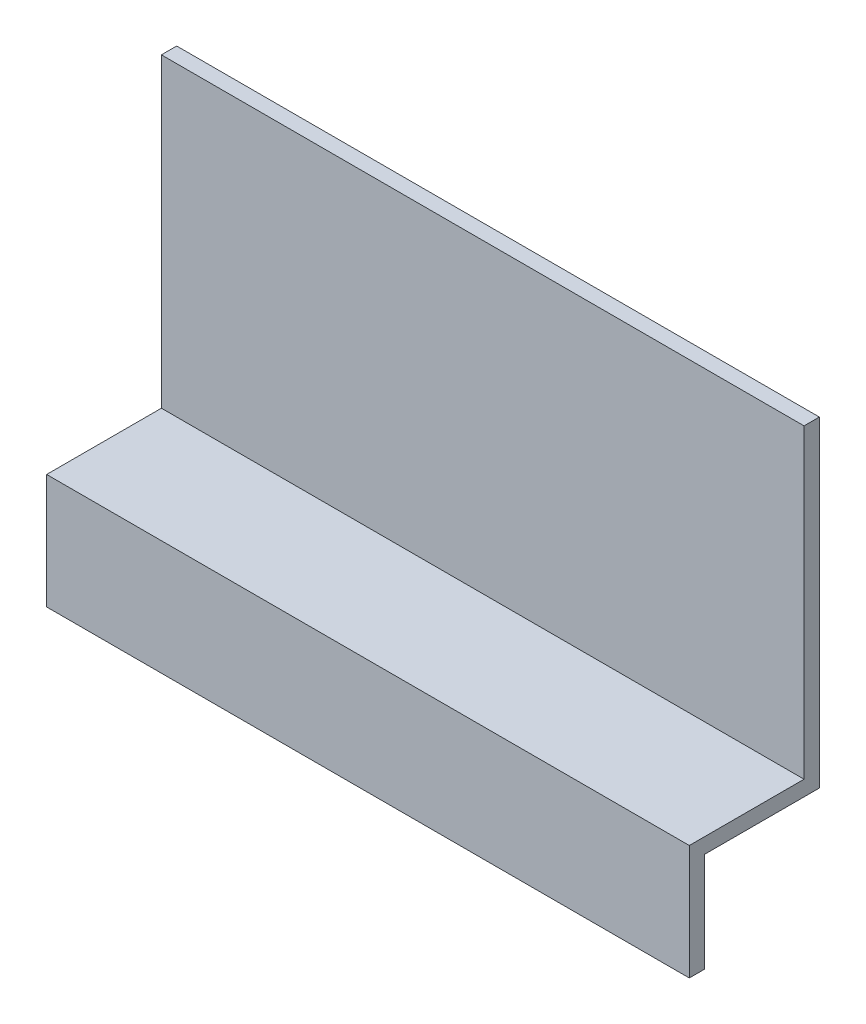
ISO-10303-21;
HEADER;
FILE_DESCRIPTION(('STEP AP214'),'2;1');
FILE_NAME('part.step','',(''),(''),'','','');
FILE_SCHEMA(('AUTOMOTIVE_DESIGN { 1 0 10303 214 1 1 1 1 }'));
ENDSEC;
DATA;
#1=APPLICATION_CONTEXT('core data for automotive mechanical design processes');
#2=APPLICATION_PROTOCOL_DEFINITION('international standard','automotive_design',2000,#1);
#3=PRODUCT_CONTEXT('',#1,'mechanical');
#4=PRODUCT('Part','Part','',(#3));
#5=PRODUCT_RELATED_PRODUCT_CATEGORY('part','',(#4));
#6=PRODUCT_DEFINITION_FORMATION('','',#4);
#7=PRODUCT_DEFINITION_CONTEXT('part definition',#1,'design');
#8=PRODUCT_DEFINITION('design','',#6,#7);
#9=PRODUCT_DEFINITION_SHAPE('','',#8);
#10=(LENGTH_UNIT() NAMED_UNIT(*) SI_UNIT(.MILLI.,.METRE.));
#11=(NAMED_UNIT(*) PLANE_ANGLE_UNIT() SI_UNIT($,.RADIAN.));
#12=(NAMED_UNIT(*) SI_UNIT($,.STERADIAN.) SOLID_ANGLE_UNIT());
#13=UNCERTAINTY_MEASURE_WITH_UNIT(LENGTH_MEASURE(1.E-05),#10,'distance_accuracy_value','');
#14=(GEOMETRIC_REPRESENTATION_CONTEXT(3) GLOBAL_UNCERTAINTY_ASSIGNED_CONTEXT((#13)) GLOBAL_UNIT_ASSIGNED_CONTEXT((#10,
#11,#12)) REPRESENTATION_CONTEXT('',''));
#15=CARTESIAN_POINT('',(0.,0.,0.));
#16=DIRECTION('',(0.,0.,1.));
#17=DIRECTION('',(1.,0.,0.));
#18=AXIS2_PLACEMENT_3D('',#15,#16,#17);
#19=CARTESIAN_POINT('',(-84.,0.,2.));
#20=DIRECTION('',(0.,-1.,0.));
#21=DIRECTION('',(0.,0.,-1.));
#22=AXIS2_PLACEMENT_3D('',#19,#20,#21);
#23=PLANE('',#22);
#24=DIRECTION('',(0.,0.,-1.));
#25=VECTOR('',#24,1.);
#26=CARTESIAN_POINT('',(0.,0.,2.));
#27=LINE('',#26,#25);
#28=CARTESIAN_POINT('',(0.,0.,2.));
#29=VERTEX_POINT('',#28);
#30=CARTESIAN_POINT('',(0.,0.,0.));
#31=VERTEX_POINT('',#30);
#32=EDGE_CURVE('E142',#29,#31,#27,.T.);
#33=ORIENTED_EDGE('',*,*,#32,.F.);
#34=DIRECTION('',(1.,0.,0.));
#35=VECTOR('',#34,1.);
#36=CARTESIAN_POINT('',(-84.,0.,2.));
#37=LINE('',#36,#35);
#38=CARTESIAN_POINT('',(-84.,0.,2.));
#39=VERTEX_POINT('',#38);
#40=EDGE_CURVE('E11',#39,#29,#37,.T.);
#41=ORIENTED_EDGE('',*,*,#40,.F.);
#42=DIRECTION('',(0.,0.,-1.));
#43=VECTOR('',#42,1.);
#44=CARTESIAN_POINT('',(-84.,0.,2.));
#45=LINE('',#44,#43);
#46=CARTESIAN_POINT('',(-84.,0.,0.));
#47=VERTEX_POINT('',#46);
#48=EDGE_CURVE('E170',#39,#47,#45,.T.);
#49=ORIENTED_EDGE('',*,*,#48,.T.);
#50=DIRECTION('',(1.,0.,0.));
#51=VECTOR('',#50,1.);
#52=CARTESIAN_POINT('',(-84.,0.,0.));
#53=LINE('',#52,#51);
#54=EDGE_CURVE('E42',#47,#31,#53,.T.);
#55=ORIENTED_EDGE('',*,*,#54,.T.);
#56=EDGE_LOOP('',(#33,#41,#49,#55));
#57=FACE_BOUND('',#56,.T.);
#58=ADVANCED_FACE('F39',(#57),#23,.T.);
#59=CARTESIAN_POINT('',(-84.,15.,2.));
#60=DIRECTION('',(0.,0.,1.));
#61=DIRECTION('',(0.,-1.,0.));
#62=AXIS2_PLACEMENT_3D('',#59,#60,#61);
#63=PLANE('',#62);
#64=DIRECTION('',(0.,-1.,0.));
#65=VECTOR('',#64,1.);
#66=CARTESIAN_POINT('',(0.,15.,2.));
#67=LINE('',#66,#65);
#68=CARTESIAN_POINT('',(0.,15.,2.));
#69=VERTEX_POINT('',#68);
#70=EDGE_CURVE('E167',#69,#29,#67,.T.);
#71=ORIENTED_EDGE('',*,*,#70,.F.);
#72=DIRECTION('',(1.,0.,0.));
#73=VECTOR('',#72,1.);
#74=CARTESIAN_POINT('',(-84.,15.,2.));
#75=LINE('',#74,#73);
#76=CARTESIAN_POINT('',(-84.,15.,2.));
#77=VERTEX_POINT('',#76);
#78=EDGE_CURVE('E49',#77,#69,#75,.T.);
#79=ORIENTED_EDGE('',*,*,#78,.F.);
#80=DIRECTION('',(0.,-1.,0.));
#81=VECTOR('',#80,1.);
#82=CARTESIAN_POINT('',(-84.,15.,2.));
#83=LINE('',#82,#81);
#84=EDGE_CURVE('E128',#77,#39,#83,.T.);
#85=ORIENTED_EDGE('',*,*,#84,.T.);
#86=ORIENTED_EDGE('',*,*,#40,.T.);
#87=EDGE_LOOP('',(#71,#79,#85,#86));
#88=FACE_BOUND('',#87,.T.);
#89=ADVANCED_FACE('F188',(#88),#63,.T.);
#90=CARTESIAN_POINT('',(-84.,15.,-13.));
#91=DIRECTION('',(0.,1.,0.));
#92=DIRECTION('',(0.,0.,1.));
#93=AXIS2_PLACEMENT_3D('',#90,#91,#92);
#94=PLANE('',#93);
#95=DIRECTION('',(0.,0.,1.));
#96=VECTOR('',#95,1.);
#97=CARTESIAN_POINT('',(0.,15.,-13.));
#98=LINE('',#97,#96);
#99=CARTESIAN_POINT('',(0.,15.,-13.));
#100=VERTEX_POINT('',#99);
#101=EDGE_CURVE('E114',#100,#69,#98,.T.);
#102=ORIENTED_EDGE('',*,*,#101,.F.);
#103=DIRECTION('',(1.,0.,0.));
#104=VECTOR('',#103,1.);
#105=CARTESIAN_POINT('',(-84.,15.,-13.));
#106=LINE('',#105,#104);
#107=CARTESIAN_POINT('',(-84.,15.,-13.));
#108=VERTEX_POINT('',#107);
#109=EDGE_CURVE('E109',#108,#100,#106,.T.);
#110=ORIENTED_EDGE('',*,*,#109,.F.);
#111=DIRECTION('',(0.,0.,1.));
#112=VECTOR('',#111,1.);
#113=CARTESIAN_POINT('',(-84.,15.,-13.));
#114=LINE('',#113,#112);
#115=EDGE_CURVE('E112',#108,#77,#114,.T.);
#116=ORIENTED_EDGE('',*,*,#115,.T.);
#117=ORIENTED_EDGE('',*,*,#78,.T.);
#118=EDGE_LOOP('',(#102,#110,#116,#117));
#119=FACE_BOUND('',#118,.T.);
#120=ADVANCED_FACE('F111',(#119),#94,.T.);
#121=CARTESIAN_POINT('',(-84.,15.,-13.));
#122=DIRECTION('',(0.,0.,1.));
#123=DIRECTION('',(1.,0.,0.));
#124=AXIS2_PLACEMENT_3D('',#121,#122,#123);
#125=PLANE('',#124);
#126=DIRECTION('',(0.,-1.,0.));
#127=VECTOR('',#126,1.);
#128=CARTESIAN_POINT('',(0.,15.,-13.));
#129=LINE('',#128,#127);
#130=CARTESIAN_POINT('',(0.,55.,-13.));
#131=VERTEX_POINT('',#130);
#132=EDGE_CURVE('E162',#131,#100,#129,.T.);
#133=ORIENTED_EDGE('',*,*,#132,.F.);
#134=DIRECTION('',(1.,0.,0.));
#135=VECTOR('',#134,1.);
#136=CARTESIAN_POINT('',(-84.,55.,-13.));
#137=LINE('',#136,#135);
#138=CARTESIAN_POINT('',(-84.,55.,-13.));
#139=VERTEX_POINT('',#138);
#140=EDGE_CURVE('E120',#139,#131,#137,.T.);
#141=ORIENTED_EDGE('',*,*,#140,.F.);
#142=DIRECTION('',(0.,-1.,0.));
#143=VECTOR('',#142,1.);
#144=CARTESIAN_POINT('',(-84.,15.,-13.));
#145=LINE('',#144,#143);
#146=EDGE_CURVE('E126',#139,#108,#145,.T.);
#147=ORIENTED_EDGE('',*,*,#146,.T.);
#148=ORIENTED_EDGE('',*,*,#109,.T.);
#149=EDGE_LOOP('',(#133,#141,#147,#148));
#150=FACE_BOUND('',#149,.T.);
#151=ADVANCED_FACE('F131',(#150),#125,.T.);
#152=CARTESIAN_POINT('',(-84.,55.,-13.));
#153=DIRECTION('',(0.,1.,0.));
#154=DIRECTION('',(0.,0.,1.));
#155=AXIS2_PLACEMENT_3D('',#152,#153,#154);
#156=PLANE('',#155);
#157=DIRECTION('',(0.,0.,1.));
#158=VECTOR('',#157,1.);
#159=CARTESIAN_POINT('',(0.,55.,-13.));
#160=LINE('',#159,#158);
#161=CARTESIAN_POINT('',(0.,55.,-15.));
#162=VERTEX_POINT('',#161);
#163=EDGE_CURVE('E158',#162,#131,#160,.T.);
#164=ORIENTED_EDGE('',*,*,#163,.F.);
#165=DIRECTION('',(1.,0.,0.));
#166=VECTOR('',#165,1.);
#167=CARTESIAN_POINT('',(-84.,55.,-15.));
#168=LINE('',#167,#166);
#169=CARTESIAN_POINT('',(-84.,55.,-15.));
#170=VERTEX_POINT('',#169);
#171=EDGE_CURVE('E176',#170,#162,#168,.T.);
#172=ORIENTED_EDGE('',*,*,#171,.F.);
#173=DIRECTION('',(0.,0.,1.));
#174=VECTOR('',#173,1.);
#175=CARTESIAN_POINT('',(-84.,55.,-13.));
#176=LINE('',#175,#174);
#177=EDGE_CURVE('E133',#170,#139,#176,.T.);
#178=ORIENTED_EDGE('',*,*,#177,.T.);
#179=ORIENTED_EDGE('',*,*,#140,.T.);
#180=EDGE_LOOP('',(#164,#172,#178,#179));
#181=FACE_BOUND('',#180,.T.);
#182=ADVANCED_FACE('F201',(#181),#156,.T.);
#183=CARTESIAN_POINT('',(-84.,55.,-15.));
#184=DIRECTION('',(0.,0.,-1.));
#185=DIRECTION('',(0.,1.,0.));
#186=AXIS2_PLACEMENT_3D('',#183,#184,#185);
#187=PLANE('',#186);
#188=DIRECTION('',(0.,1.,0.));
#189=VECTOR('',#188,1.);
#190=CARTESIAN_POINT('',(0.,55.,-15.));
#191=LINE('',#190,#189);
#192=CARTESIAN_POINT('',(0.,13.,-15.));
#193=VERTEX_POINT('',#192);
#194=EDGE_CURVE('E154',#193,#162,#191,.T.);
#195=ORIENTED_EDGE('',*,*,#194,.F.);
#196=DIRECTION('',(1.,0.,0.));
#197=VECTOR('',#196,1.);
#198=CARTESIAN_POINT('',(-84.,13.,-15.));
#199=LINE('',#198,#197);
#200=CARTESIAN_POINT('',(-84.,13.,-15.));
#201=VERTEX_POINT('',#200);
#202=EDGE_CURVE('E179',#201,#193,#199,.T.);
#203=ORIENTED_EDGE('',*,*,#202,.F.);
#204=DIRECTION('',(0.,1.,0.));
#205=VECTOR('',#204,1.);
#206=CARTESIAN_POINT('',(-84.,55.,-15.));
#207=LINE('',#206,#205);
#208=EDGE_CURVE('E136',#201,#170,#207,.T.);
#209=ORIENTED_EDGE('',*,*,#208,.T.);
#210=ORIENTED_EDGE('',*,*,#171,.T.);
#211=EDGE_LOOP('',(#195,#203,#209,#210));
#212=FACE_BOUND('',#211,.T.);
#213=ADVANCED_FACE('F204',(#212),#187,.T.);
#214=CARTESIAN_POINT('',(-84.,13.,0.));
#215=DIRECTION('',(0.,-1.,0.));
#216=DIRECTION('',(0.,0.,-1.));
#217=AXIS2_PLACEMENT_3D('',#214,#215,#216);
#218=PLANE('',#217);
#219=DIRECTION('',(0.,0.,-1.));
#220=VECTOR('',#219,1.);
#221=CARTESIAN_POINT('',(0.,13.,0.));
#222=LINE('',#221,#220);
#223=CARTESIAN_POINT('',(0.,13.,0.));
#224=VERTEX_POINT('',#223);
#225=EDGE_CURVE('E150',#224,#193,#222,.T.);
#226=ORIENTED_EDGE('',*,*,#225,.F.);
#227=DIRECTION('',(1.,0.,0.));
#228=VECTOR('',#227,1.);
#229=CARTESIAN_POINT('',(-84.,13.,0.));
#230=LINE('',#229,#228);
#231=CARTESIAN_POINT('',(-84.,13.,0.));
#232=VERTEX_POINT('',#231);
#233=EDGE_CURVE('E181',#232,#224,#230,.T.);
#234=ORIENTED_EDGE('',*,*,#233,.F.);
#235=DIRECTION('',(0.,0.,-1.));
#236=VECTOR('',#235,1.);
#237=CARTESIAN_POINT('',(-84.,13.,0.));
#238=LINE('',#237,#236);
#239=EDGE_CURVE('E279',#232,#201,#238,.T.);
#240=ORIENTED_EDGE('',*,*,#239,.T.);
#241=ORIENTED_EDGE('',*,*,#202,.T.);
#242=EDGE_LOOP('',(#226,#234,#240,#241));
#243=FACE_BOUND('',#242,.T.);
#244=ADVANCED_FACE('F208',(#243),#218,.T.);
#245=CARTESIAN_POINT('',(-84.,0.,0.));
#246=DIRECTION('',(0.,0.,-1.));
#247=DIRECTION('',(-1.,0.,0.));
#248=AXIS2_PLACEMENT_3D('',#245,#246,#247);
#249=PLANE('',#248);
#250=DIRECTION('',(0.,1.,0.));
#251=VECTOR('',#250,1.);
#252=CARTESIAN_POINT('',(0.,0.,0.));
#253=LINE('',#252,#251);
#254=EDGE_CURVE('E146',#31,#224,#253,.T.);
#255=ORIENTED_EDGE('',*,*,#254,.F.);
#256=ORIENTED_EDGE('',*,*,#54,.F.);
#257=DIRECTION('',(0.,1.,0.));
#258=VECTOR('',#257,1.);
#259=CARTESIAN_POINT('',(-84.,0.,0.));
#260=LINE('',#259,#258);
#261=EDGE_CURVE('E282',#47,#232,#260,.T.);
#262=ORIENTED_EDGE('',*,*,#261,.T.);
#263=ORIENTED_EDGE('',*,*,#233,.T.);
#264=EDGE_LOOP('',(#255,#256,#262,#263));
#265=FACE_BOUND('',#264,.T.);
#266=ADVANCED_FACE('F185',(#265),#249,.T.);
#267=CARTESIAN_POINT('',(-84.,0.,0.));
#268=DIRECTION('',(1.,0.,0.));
#269=DIRECTION('',(0.,0.,-1.));
#270=AXIS2_PLACEMENT_3D('',#267,#268,#269);
#271=PLANE('',#270);
#272=ORIENTED_EDGE('',*,*,#48,.F.);
#273=ORIENTED_EDGE('',*,*,#84,.F.);
#274=ORIENTED_EDGE('',*,*,#115,.F.);
#275=ORIENTED_EDGE('',*,*,#146,.F.);
#276=ORIENTED_EDGE('',*,*,#177,.F.);
#277=ORIENTED_EDGE('',*,*,#208,.F.);
#278=ORIENTED_EDGE('',*,*,#239,.F.);
#279=ORIENTED_EDGE('',*,*,#261,.F.);
#280=EDGE_LOOP('',(#272,#273,#274,#275,#276,#277,#278,#279));
#281=FACE_BOUND('',#280,.T.);
#282=ADVANCED_FACE('F124',(#281),#271,.F.);
#283=CARTESIAN_POINT('',(0.,0.,0.));
#284=DIRECTION('',(1.,0.,0.));
#285=DIRECTION('',(0.,0.,-1.));
#286=AXIS2_PLACEMENT_3D('',#283,#284,#285);
#287=PLANE('',#286);
#288=ORIENTED_EDGE('',*,*,#32,.T.);
#289=ORIENTED_EDGE('',*,*,#254,.T.);
#290=ORIENTED_EDGE('',*,*,#225,.T.);
#291=ORIENTED_EDGE('',*,*,#194,.T.);
#292=ORIENTED_EDGE('',*,*,#163,.T.);
#293=ORIENTED_EDGE('',*,*,#132,.T.);
#294=ORIENTED_EDGE('',*,*,#101,.T.);
#295=ORIENTED_EDGE('',*,*,#70,.T.);
#296=EDGE_LOOP('',(#288,#289,#290,#291,#292,#293,#294,#295));
#297=FACE_BOUND('',#296,.T.);
#298=ADVANCED_FACE('F187',(#297),#287,.T.);
#299=CLOSED_SHELL('',(#58,#89,#120,#151,#182,#213,#244,#266,#282,#298));
#300=MANIFOLD_SOLID_BREP('B2',#299);
#301=ADVANCED_BREP_SHAPE_REPRESENTATION('',(#18,#300),#14);
#302=SHAPE_DEFINITION_REPRESENTATION(#9,#301);
ENDSEC;
END-ISO-10303-21;
